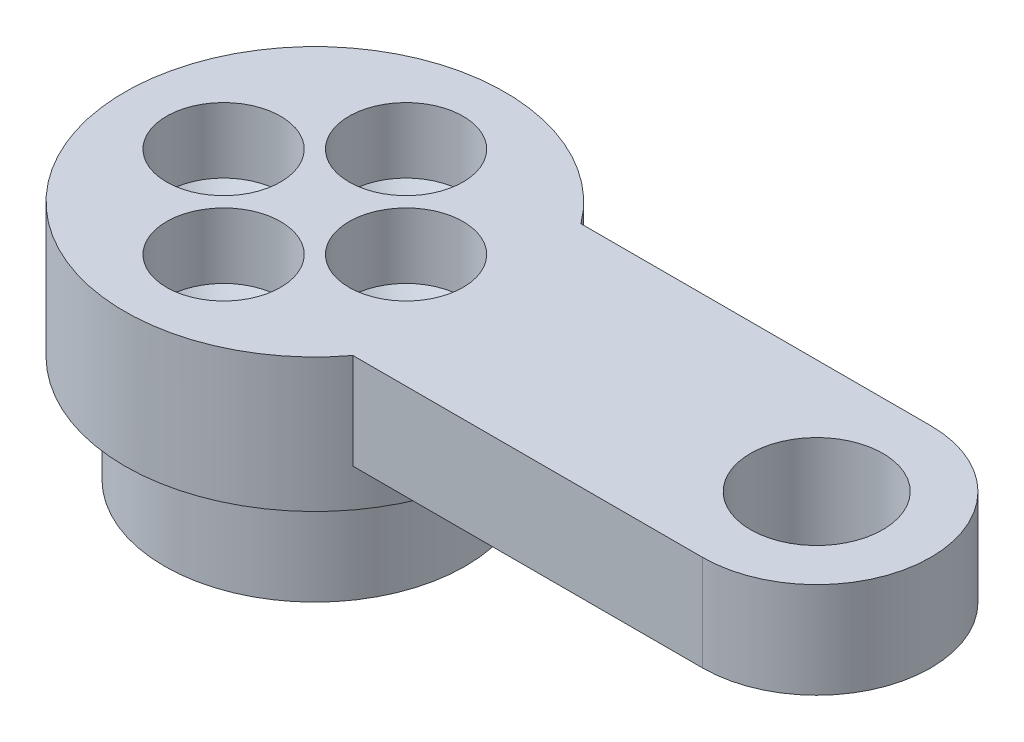
ISO-10303-21;
HEADER;
FILE_DESCRIPTION(('STEP AP214'),'2;1');
FILE_NAME('part.step','',(''),(''),'','','');
FILE_SCHEMA(('AUTOMOTIVE_DESIGN { 1 0 10303 214 1 1 1 1 }'));
ENDSEC;
DATA;
#1=APPLICATION_CONTEXT('core data for automotive mechanical design processes');
#2=APPLICATION_PROTOCOL_DEFINITION('international standard','automotive_design',2000,#1);
#3=PRODUCT_CONTEXT('',#1,'mechanical');
#4=PRODUCT('Part','Part','',(#3));
#5=PRODUCT_RELATED_PRODUCT_CATEGORY('part','',(#4));
#6=PRODUCT_DEFINITION_FORMATION('','',#4);
#7=PRODUCT_DEFINITION_CONTEXT('part definition',#1,'design');
#8=PRODUCT_DEFINITION('design','',#6,#7);
#9=PRODUCT_DEFINITION_SHAPE('','',#8);
#10=(LENGTH_UNIT() NAMED_UNIT(*) SI_UNIT(.MILLI.,.METRE.));
#11=(NAMED_UNIT(*) PLANE_ANGLE_UNIT() SI_UNIT($,.RADIAN.));
#12=(NAMED_UNIT(*) SI_UNIT($,.STERADIAN.) SOLID_ANGLE_UNIT());
#13=UNCERTAINTY_MEASURE_WITH_UNIT(LENGTH_MEASURE(1.E-05),#10,'distance_accuracy_value','');
#14=(GEOMETRIC_REPRESENTATION_CONTEXT(3) GLOBAL_UNCERTAINTY_ASSIGNED_CONTEXT((#13)) GLOBAL_UNIT_ASSIGNED_CONTEXT((#10,
#11,#12)) REPRESENTATION_CONTEXT('',''));
#15=CARTESIAN_POINT('',(0.,0.,0.));
#16=DIRECTION('',(0.,0.,1.));
#17=DIRECTION('',(1.,0.,0.));
#18=AXIS2_PLACEMENT_3D('',#15,#16,#17);
#19=CARTESIAN_POINT('',(0.,0.,0.));
#20=DIRECTION('',(0.,1.,0.));
#21=DIRECTION('',(0.,0.,1.));
#22=AXIS2_PLACEMENT_3D('',#19,#20,#21);
#23=PLANE('',#22);
#24=CARTESIAN_POINT('',(0.,0.,0.));
#25=DIRECTION('',(0.,1.,0.));
#26=DIRECTION('',(0.,0.,1.));
#27=AXIS2_PLACEMENT_3D('',#24,#25,#26);
#28=CIRCLE('',#27,9.9);
#29=CARTESIAN_POINT('',(0.,0.,9.9));
#30=VERTEX_POINT('',#29);
#31=EDGE_CURVE('E149',#30,#30,#28,.T.);
#32=ORIENTED_EDGE('',*,*,#31,.F.);
#33=EDGE_LOOP('',(#32));
#34=FACE_BOUND('',#33,.T.);
#35=CARTESIAN_POINT('',(6.,0.,0.));
#36=DIRECTION('',(0.,1.,0.));
#37=DIRECTION('',(0.,0.,1.));
#38=AXIS2_PLACEMENT_3D('',#35,#36,#37);
#39=CIRCLE('',#38,1.85);
#40=CARTESIAN_POINT('',(6.,0.,1.85));
#41=VERTEX_POINT('',#40);
#42=EDGE_CURVE('E146',#41,#41,#39,.T.);
#43=ORIENTED_EDGE('',*,*,#42,.T.);
#44=EDGE_LOOP('',(#43));
#45=FACE_BOUND('',#44,.T.);
#46=CARTESIAN_POINT('',(0.,0.,6.));
#47=DIRECTION('',(0.,1.,0.));
#48=DIRECTION('',(0.,0.,1.));
#49=AXIS2_PLACEMENT_3D('',#46,#47,#48);
#50=CIRCLE('',#49,1.85);
#51=CARTESIAN_POINT('',(0.,0.,7.85));
#52=VERTEX_POINT('',#51);
#53=EDGE_CURVE('E143',#52,#52,#50,.T.);
#54=ORIENTED_EDGE('',*,*,#53,.T.);
#55=EDGE_LOOP('',(#54));
#56=FACE_BOUND('',#55,.T.);
#57=CARTESIAN_POINT('',(-6.,0.,0.));
#58=DIRECTION('',(0.,1.,0.));
#59=DIRECTION('',(0.,0.,1.));
#60=AXIS2_PLACEMENT_3D('',#57,#58,#59);
#61=CIRCLE('',#60,1.85);
#62=CARTESIAN_POINT('',(-6.,0.,1.85));
#63=VERTEX_POINT('',#62);
#64=EDGE_CURVE('E140',#63,#63,#61,.T.);
#65=ORIENTED_EDGE('',*,*,#64,.T.);
#66=EDGE_LOOP('',(#65));
#67=FACE_BOUND('',#66,.T.);
#68=CARTESIAN_POINT('',(0.,0.,-6.));
#69=DIRECTION('',(0.,1.,0.));
#70=DIRECTION('',(0.,0.,1.));
#71=AXIS2_PLACEMENT_3D('',#68,#69,#70);
#72=CIRCLE('',#71,1.85);
#73=CARTESIAN_POINT('',(0.,0.,-4.15));
#74=VERTEX_POINT('',#73);
#75=EDGE_CURVE('E135',#74,#74,#72,.T.);
#76=ORIENTED_EDGE('',*,*,#75,.T.);
#77=EDGE_LOOP('',(#76));
#78=FACE_BOUND('',#77,.T.);
#79=ADVANCED_FACE('F36',(#34,#45,#56,#67,#78),#23,.F.);
#80=CARTESIAN_POINT('',(0.,7.,0.));
#81=DIRECTION('',(0.,-1.,0.));
#82=DIRECTION('',(0.,0.,-1.));
#83=AXIS2_PLACEMENT_3D('',#80,#81,#82);
#84=CYLINDRICAL_SURFACE('',#83,9.9);
#85=CARTESIAN_POINT('',(0.,7.,0.));
#86=DIRECTION('',(0.,1.,0.));
#87=DIRECTION('',(0.,0.,1.));
#88=AXIS2_PLACEMENT_3D('',#85,#86,#87);
#89=CIRCLE('',#88,9.9);
#90=CARTESIAN_POINT('',(0.,7.,9.9));
#91=VERTEX_POINT('',#90);
#92=EDGE_CURVE('E150',#91,#91,#89,.T.);
#93=ORIENTED_EDGE('',*,*,#92,.F.);
#94=EDGE_LOOP('',(#93));
#95=FACE_BOUND('',#94,.T.);
#96=ORIENTED_EDGE('',*,*,#31,.T.);
#97=EDGE_LOOP('',(#96));
#98=FACE_BOUND('',#97,.T.);
#99=ADVANCED_FACE('F192',(#95,#98),#84,.T.);
#100=CARTESIAN_POINT('',(6.,7.,0.));
#101=DIRECTION('',(0.,-1.,0.));
#102=DIRECTION('',(0.,0.,-1.));
#103=AXIS2_PLACEMENT_3D('',#100,#101,#102);
#104=CYLINDRICAL_SURFACE('',#103,1.85);
#105=CARTESIAN_POINT('',(6.,9.60000000000003,0.));
#106=DIRECTION('',(0.,1.,0.));
#107=DIRECTION('',(0.,0.,1.));
#108=AXIS2_PLACEMENT_3D('',#105,#106,#107);
#109=CIRCLE('',#108,1.85);
#110=CARTESIAN_POINT('',(6.,9.60000000000003,1.85));
#111=VERTEX_POINT('',#110);
#112=EDGE_CURVE('E11',#111,#111,#109,.T.);
#113=ORIENTED_EDGE('',*,*,#112,.T.);
#114=EDGE_LOOP('',(#113));
#115=FACE_BOUND('',#114,.T.);
#116=ORIENTED_EDGE('',*,*,#42,.F.);
#117=EDGE_LOOP('',(#116));
#118=FACE_BOUND('',#117,.T.);
#119=ADVANCED_FACE('F198',(#115,#118),#104,.F.);
#120=CARTESIAN_POINT('',(0.,7.,6.));
#121=DIRECTION('',(0.,-1.,0.));
#122=DIRECTION('',(0.,0.,-1.));
#123=AXIS2_PLACEMENT_3D('',#120,#121,#122);
#124=CYLINDRICAL_SURFACE('',#123,1.85);
#125=CARTESIAN_POINT('',(0.,9.60000000000003,5.99999999999999));
#126=DIRECTION('',(0.,1.,0.));
#127=DIRECTION('',(0.,0.,1.));
#128=AXIS2_PLACEMENT_3D('',#125,#126,#127);
#129=CIRCLE('',#128,1.85);
#130=CARTESIAN_POINT('',(0.,9.60000000000003,7.84999999999999));
#131=VERTEX_POINT('',#130);
#132=EDGE_CURVE('E167',#131,#131,#129,.T.);
#133=ORIENTED_EDGE('',*,*,#132,.T.);
#134=EDGE_LOOP('',(#133));
#135=FACE_BOUND('',#134,.T.);
#136=ORIENTED_EDGE('',*,*,#53,.F.);
#137=EDGE_LOOP('',(#136));
#138=FACE_BOUND('',#137,.T.);
#139=ADVANCED_FACE('F218',(#135,#138),#124,.F.);
#140=CARTESIAN_POINT('',(-6.,7.,0.));
#141=DIRECTION('',(0.,-1.,0.));
#142=DIRECTION('',(0.,0.,-1.));
#143=AXIS2_PLACEMENT_3D('',#140,#141,#142);
#144=CYLINDRICAL_SURFACE('',#143,1.85);
#145=CARTESIAN_POINT('',(-6.,9.60000000000003,0.));
#146=DIRECTION('',(0.,1.,0.));
#147=DIRECTION('',(0.,0.,1.));
#148=AXIS2_PLACEMENT_3D('',#145,#146,#147);
#149=CIRCLE('',#148,1.85);
#150=CARTESIAN_POINT('',(-6.,9.60000000000003,1.84999999999996));
#151=VERTEX_POINT('',#150);
#152=EDGE_CURVE('E170',#151,#151,#149,.T.);
#153=ORIENTED_EDGE('',*,*,#152,.T.);
#154=EDGE_LOOP('',(#153));
#155=FACE_BOUND('',#154,.T.);
#156=ORIENTED_EDGE('',*,*,#64,.F.);
#157=EDGE_LOOP('',(#156));
#158=FACE_BOUND('',#157,.T.);
#159=ADVANCED_FACE('F221',(#155,#158),#144,.F.);
#160=CARTESIAN_POINT('',(0.,7.,-6.));
#161=DIRECTION('',(0.,-1.,0.));
#162=DIRECTION('',(0.,0.,-1.));
#163=AXIS2_PLACEMENT_3D('',#160,#161,#162);
#164=CYLINDRICAL_SURFACE('',#163,1.85);
#165=CARTESIAN_POINT('',(0.,9.59999999999997,-6.));
#166=DIRECTION('',(0.,1.,0.));
#167=DIRECTION('',(0.,0.,1.));
#168=AXIS2_PLACEMENT_3D('',#165,#166,#167);
#169=CIRCLE('',#168,1.85);
#170=CARTESIAN_POINT('',(0.,9.59999999999997,-4.15));
#171=VERTEX_POINT('',#170);
#172=EDGE_CURVE('E44',#171,#171,#169,.T.);
#173=ORIENTED_EDGE('',*,*,#172,.T.);
#174=EDGE_LOOP('',(#173));
#175=FACE_BOUND('',#174,.T.);
#176=ORIENTED_EDGE('',*,*,#75,.F.);
#177=EDGE_LOOP('',(#176));
#178=FACE_BOUND('',#177,.T.);
#179=ADVANCED_FACE('F175',(#175,#178),#164,.F.);
#180=CARTESIAN_POINT('',(0.,7.,0.));
#181=DIRECTION('',(0.,1.,0.));
#182=DIRECTION('',(0.,0.,1.));
#183=AXIS2_PLACEMENT_3D('',#180,#181,#182);
#184=PLANE('',#183);
#185=ORIENTED_EDGE('',*,*,#92,.T.);
#186=EDGE_LOOP('',(#185));
#187=FACE_BOUND('',#186,.T.);
#188=CARTESIAN_POINT('',(0.,7.,0.));
#189=DIRECTION('',(0.,1.,0.));
#190=DIRECTION('',(0.,0.,1.));
#191=AXIS2_PLACEMENT_3D('',#188,#189,#190);
#192=CIRCLE('',#191,12.5);
#193=CARTESIAN_POINT('',(0.,7.,12.5));
#194=VERTEX_POINT('',#193);
#195=EDGE_CURVE('E133',#194,#194,#192,.T.);
#196=ORIENTED_EDGE('',*,*,#195,.F.);
#197=EDGE_LOOP('',(#196));
#198=FACE_BOUND('',#197,.T.);
#199=ADVANCED_FACE('F229',(#187,#198),#184,.F.);
#200=CARTESIAN_POINT('',(0.,9.5,0.));
#201=DIRECTION('',(0.,-1.,0.));
#202=DIRECTION('',(0.,0.,-1.));
#203=AXIS2_PLACEMENT_3D('',#200,#201,#202);
#204=CYLINDRICAL_SURFACE('',#203,12.5);
#205=CARTESIAN_POINT('',(0.,9.5,0.));
#206=DIRECTION('',(0.,1.,0.));
#207=DIRECTION('',(0.,0.,1.));
#208=AXIS2_PLACEMENT_3D('',#205,#206,#207);
#209=CIRCLE('',#208,12.5);
#210=CARTESIAN_POINT('',(10.,9.5,7.5));
#211=VERTEX_POINT('',#210);
#212=CARTESIAN_POINT('',(10.,9.5,-7.5));
#213=VERTEX_POINT('',#212);
#214=EDGE_CURVE('E51',#211,#213,#209,.T.);
#215=ORIENTED_EDGE('',*,*,#214,.F.);
#216=DIRECTION('',(0.,-1.,0.));
#217=VECTOR('',#216,1.);
#218=CARTESIAN_POINT('',(10.,15.8,7.5));
#219=LINE('',#218,#217);
#220=CARTESIAN_POINT('',(10.,15.8,7.5));
#221=VERTEX_POINT('',#220);
#222=EDGE_CURVE('E99',#221,#211,#219,.T.);
#223=ORIENTED_EDGE('',*,*,#222,.F.);
#224=CARTESIAN_POINT('',(0.,15.8,0.));
#225=DIRECTION('',(0.,1.,0.));
#226=DIRECTION('',(0.,0.,1.));
#227=AXIS2_PLACEMENT_3D('',#224,#225,#226);
#228=CIRCLE('',#227,12.5);
#229=CARTESIAN_POINT('',(10.,15.8,-7.5));
#230=VERTEX_POINT('',#229);
#231=EDGE_CURVE('E88',#230,#221,#228,.T.);
#232=ORIENTED_EDGE('',*,*,#231,.F.);
#233=DIRECTION('',(0.,-1.,0.));
#234=VECTOR('',#233,1.);
#235=CARTESIAN_POINT('',(10.,15.8,-7.5));
#236=LINE('',#235,#234);
#237=EDGE_CURVE('E94',#230,#213,#236,.T.);
#238=ORIENTED_EDGE('',*,*,#237,.T.);
#239=EDGE_LOOP('',(#215,#223,#232,#238));
#240=FACE_BOUND('',#239,.T.);
#241=ORIENTED_EDGE('',*,*,#195,.T.);
#242=EDGE_LOOP('',(#241));
#243=FACE_BOUND('',#242,.T.);
#244=ADVANCED_FACE('F101',(#240,#243),#204,.T.);
#245=CARTESIAN_POINT('',(0.,9.5,0.));
#246=DIRECTION('',(0.,1.,0.));
#247=DIRECTION('',(0.,0.,1.));
#248=AXIS2_PLACEMENT_3D('',#245,#246,#247);
#249=PLANE('',#248);
#250=CARTESIAN_POINT('',(33.,9.5,0.));
#251=DIRECTION('',(0.,1.,0.));
#252=DIRECTION('',(0.,0.,1.));
#253=AXIS2_PLACEMENT_3D('',#250,#251,#252);
#254=CIRCLE('',#253,4.35);
#255=CARTESIAN_POINT('',(33.,9.5,4.35));
#256=VERTEX_POINT('',#255);
#257=EDGE_CURVE('E121',#256,#256,#254,.T.);
#258=ORIENTED_EDGE('',*,*,#257,.T.);
#259=EDGE_LOOP('',(#258));
#260=FACE_BOUND('',#259,.T.);
#261=DIRECTION('',(-1.,0.,0.));
#262=VECTOR('',#261,1.);
#263=CARTESIAN_POINT('',(0.,9.5,7.50000000000001));
#264=LINE('',#263,#262);
#265=CARTESIAN_POINT('',(33.,9.5,7.5));
#266=VERTEX_POINT('',#265);
#267=EDGE_CURVE('E127',#266,#211,#264,.T.);
#268=ORIENTED_EDGE('',*,*,#267,.T.);
#269=ORIENTED_EDGE('',*,*,#214,.T.);
#270=DIRECTION('',(-1.,0.,0.));
#271=VECTOR('',#270,1.);
#272=CARTESIAN_POINT('',(0.,9.5,-7.50000000000001));
#273=LINE('',#272,#271);
#274=CARTESIAN_POINT('',(33.,9.5,-7.5));
#275=VERTEX_POINT('',#274);
#276=EDGE_CURVE('E96',#275,#213,#273,.T.);
#277=ORIENTED_EDGE('',*,*,#276,.F.);
#278=CARTESIAN_POINT('',(33.,9.5,0.));
#279=DIRECTION('',(0.,1.,0.));
#280=DIRECTION('',(0.,0.,1.));
#281=AXIS2_PLACEMENT_3D('',#278,#279,#280);
#282=CIRCLE('',#281,7.5);
#283=EDGE_CURVE('E124',#266,#275,#282,.T.);
#284=ORIENTED_EDGE('',*,*,#283,.F.);
#285=EDGE_LOOP('',(#268,#269,#277,#284));
#286=FACE_BOUND('',#285,.T.);
#287=ADVANCED_FACE('F241',(#260,#286),#249,.F.);
#288=CARTESIAN_POINT('',(33.,15.8,0.));
#289=DIRECTION('',(0.,-1.,0.));
#290=DIRECTION('',(0.,0.,-1.));
#291=AXIS2_PLACEMENT_3D('',#288,#289,#290);
#292=CYLINDRICAL_SURFACE('',#291,7.5);
#293=ORIENTED_EDGE('',*,*,#283,.T.);
#294=DIRECTION('',(0.,-1.,0.));
#295=VECTOR('',#294,1.);
#296=CARTESIAN_POINT('',(33.,15.8,-7.5));
#297=LINE('',#296,#295);
#298=CARTESIAN_POINT('',(33.,15.8,-7.5));
#299=VERTEX_POINT('',#298);
#300=EDGE_CURVE('E98',#299,#275,#297,.T.);
#301=ORIENTED_EDGE('',*,*,#300,.F.);
#302=CARTESIAN_POINT('',(33.,15.8,0.));
#303=DIRECTION('',(0.,1.,0.));
#304=DIRECTION('',(0.,0.,1.));
#305=AXIS2_PLACEMENT_3D('',#302,#303,#304);
#306=CIRCLE('',#305,7.5);
#307=CARTESIAN_POINT('',(33.,15.8,7.5));
#308=VERTEX_POINT('',#307);
#309=EDGE_CURVE('E90',#308,#299,#306,.T.);
#310=ORIENTED_EDGE('',*,*,#309,.F.);
#311=DIRECTION('',(0.,-1.,0.));
#312=VECTOR('',#311,1.);
#313=CARTESIAN_POINT('',(33.,15.8,7.5));
#314=LINE('',#313,#312);
#315=EDGE_CURVE('E60',#308,#266,#314,.T.);
#316=ORIENTED_EDGE('',*,*,#315,.T.);
#317=EDGE_LOOP('',(#293,#301,#310,#316));
#318=FACE_BOUND('',#317,.T.);
#319=ADVANCED_FACE('F248',(#318),#292,.T.);
#320=CARTESIAN_POINT('',(0.,15.8,-7.50000000000001));
#321=DIRECTION('',(0.,0.,1.));
#322=DIRECTION('',(1.,0.,0.));
#323=AXIS2_PLACEMENT_3D('',#320,#321,#322);
#324=PLANE('',#323);
#325=ORIENTED_EDGE('',*,*,#276,.T.);
#326=ORIENTED_EDGE('',*,*,#237,.F.);
#327=DIRECTION('',(-1.,0.,0.));
#328=VECTOR('',#327,1.);
#329=CARTESIAN_POINT('',(0.,15.8,-7.50000000000001));
#330=LINE('',#329,#328);
#331=EDGE_CURVE('E81',#299,#230,#330,.T.);
#332=ORIENTED_EDGE('',*,*,#331,.F.);
#333=ORIENTED_EDGE('',*,*,#300,.T.);
#334=EDGE_LOOP('',(#325,#326,#332,#333));
#335=FACE_BOUND('',#334,.T.);
#336=ADVANCED_FACE('F95',(#335),#324,.F.);
#337=CARTESIAN_POINT('',(0.,15.8,5.99999999999999));
#338=DIRECTION('',(0.,-1.,0.));
#339=DIRECTION('',(0.,0.,-1.));
#340=AXIS2_PLACEMENT_3D('',#337,#338,#339);
#341=CYLINDRICAL_SURFACE('',#340,3.75);
#342=CARTESIAN_POINT('',(0.,11.5,5.99999999999999));
#343=DIRECTION('',(0.,1.,0.));
#344=DIRECTION('',(0.,0.,1.));
#345=AXIS2_PLACEMENT_3D('',#342,#343,#344);
#346=CIRCLE('',#345,3.75);
#347=CARTESIAN_POINT('',(0.,11.5,9.74999999999999));
#348=VERTEX_POINT('',#347);
#349=EDGE_CURVE('E153',#348,#348,#346,.F.);
#350=ORIENTED_EDGE('',*,*,#349,.T.);
#351=EDGE_LOOP('',(#350));
#352=FACE_BOUND('',#351,.T.);
#353=CARTESIAN_POINT('',(0.,15.8,5.99999999999999));
#354=DIRECTION('',(0.,1.,0.));
#355=DIRECTION('',(0.,0.,1.));
#356=AXIS2_PLACEMENT_3D('',#353,#354,#355);
#357=CIRCLE('',#356,3.75);
#358=CARTESIAN_POINT('',(0.,15.8,9.74999999999999));
#359=VERTEX_POINT('',#358);
#360=EDGE_CURVE('E115',#359,#359,#357,.T.);
#361=ORIENTED_EDGE('',*,*,#360,.T.);
#362=EDGE_LOOP('',(#361));
#363=FACE_BOUND('',#362,.T.);
#364=ADVANCED_FACE('F253',(#352,#363),#341,.F.);
#365=CARTESIAN_POINT('',(6.,15.8,0.));
#366=DIRECTION('',(0.,-1.,0.));
#367=DIRECTION('',(0.,0.,-1.));
#368=AXIS2_PLACEMENT_3D('',#365,#366,#367);
#369=CYLINDRICAL_SURFACE('',#368,3.75);
#370=CARTESIAN_POINT('',(6.,11.5,0.));
#371=DIRECTION('',(0.,1.,0.));
#372=DIRECTION('',(0.,0.,1.));
#373=AXIS2_PLACEMENT_3D('',#370,#371,#372);
#374=CIRCLE('',#373,3.75);
#375=CARTESIAN_POINT('',(6.,11.5,3.75));
#376=VERTEX_POINT('',#375);
#377=EDGE_CURVE('E164',#376,#376,#374,.F.);
#378=ORIENTED_EDGE('',*,*,#377,.T.);
#379=EDGE_LOOP('',(#378));
#380=FACE_BOUND('',#379,.T.);
#381=CARTESIAN_POINT('',(6.,15.8,0.));
#382=DIRECTION('',(0.,1.,0.));
#383=DIRECTION('',(0.,0.,1.));
#384=AXIS2_PLACEMENT_3D('',#381,#382,#383);
#385=CIRCLE('',#384,3.75);
#386=CARTESIAN_POINT('',(6.,15.8,3.75));
#387=VERTEX_POINT('',#386);
#388=EDGE_CURVE('E112',#387,#387,#385,.T.);
#389=ORIENTED_EDGE('',*,*,#388,.T.);
#390=EDGE_LOOP('',(#389));
#391=FACE_BOUND('',#390,.T.);
#392=ADVANCED_FACE('F259',(#380,#391),#369,.F.);
#393=CARTESIAN_POINT('',(-6.,15.8,0.));
#394=DIRECTION('',(0.,-1.,0.));
#395=DIRECTION('',(0.,0.,-1.));
#396=AXIS2_PLACEMENT_3D('',#393,#394,#395);
#397=CYLINDRICAL_SURFACE('',#396,3.75);
#398=CARTESIAN_POINT('',(-6.,11.5,0.));
#399=DIRECTION('',(0.,1.,0.));
#400=DIRECTION('',(0.,0.,1.));
#401=AXIS2_PLACEMENT_3D('',#398,#399,#400);
#402=CIRCLE('',#401,3.75);
#403=CARTESIAN_POINT('',(-6.,11.5,3.74999999999996));
#404=VERTEX_POINT('',#403);
#405=EDGE_CURVE('E158',#404,#404,#402,.F.);
#406=ORIENTED_EDGE('',*,*,#405,.T.);
#407=EDGE_LOOP('',(#406));
#408=FACE_BOUND('',#407,.T.);
#409=CARTESIAN_POINT('',(-6.,15.8,0.));
#410=DIRECTION('',(0.,1.,0.));
#411=DIRECTION('',(0.,0.,1.));
#412=AXIS2_PLACEMENT_3D('',#409,#410,#411);
#413=CIRCLE('',#412,3.75);
#414=CARTESIAN_POINT('',(-6.,15.8,3.74999999999996));
#415=VERTEX_POINT('',#414);
#416=EDGE_CURVE('E106',#415,#415,#413,.T.);
#417=ORIENTED_EDGE('',*,*,#416,.T.);
#418=EDGE_LOOP('',(#417));
#419=FACE_BOUND('',#418,.T.);
#420=ADVANCED_FACE('F256',(#408,#419),#397,.F.);
#421=CARTESIAN_POINT('',(0.,15.8,7.50000000000001));
#422=DIRECTION('',(0.,0.,1.));
#423=DIRECTION('',(1.,0.,0.));
#424=AXIS2_PLACEMENT_3D('',#421,#422,#423);
#425=PLANE('',#424);
#426=ORIENTED_EDGE('',*,*,#267,.F.);
#427=ORIENTED_EDGE('',*,*,#315,.F.);
#428=DIRECTION('',(-1.,0.,0.));
#429=VECTOR('',#428,1.);
#430=CARTESIAN_POINT('',(0.,15.8,7.50000000000001));
#431=LINE('',#430,#429);
#432=EDGE_CURVE('E104',#308,#221,#431,.T.);
#433=ORIENTED_EDGE('',*,*,#432,.T.);
#434=ORIENTED_EDGE('',*,*,#222,.T.);
#435=EDGE_LOOP('',(#426,#427,#433,#434));
#436=FACE_BOUND('',#435,.T.);
#437=ADVANCED_FACE('F246',(#436),#425,.T.);
#438=CARTESIAN_POINT('',(33.,15.8,0.));
#439=DIRECTION('',(0.,-1.,0.));
#440=DIRECTION('',(0.,0.,-1.));
#441=AXIS2_PLACEMENT_3D('',#438,#439,#440);
#442=CYLINDRICAL_SURFACE('',#441,4.35);
#443=CARTESIAN_POINT('',(33.,15.8,0.));
#444=DIRECTION('',(0.,1.,0.));
#445=DIRECTION('',(0.,0.,1.));
#446=AXIS2_PLACEMENT_3D('',#443,#444,#445);
#447=CIRCLE('',#446,4.35);
#448=CARTESIAN_POINT('',(33.,15.8,4.35));
#449=VERTEX_POINT('',#448);
#450=EDGE_CURVE('E129',#449,#449,#447,.T.);
#451=ORIENTED_EDGE('',*,*,#450,.T.);
#452=EDGE_LOOP('',(#451));
#453=FACE_BOUND('',#452,.T.);
#454=ORIENTED_EDGE('',*,*,#257,.F.);
#455=EDGE_LOOP('',(#454));
#456=FACE_BOUND('',#455,.T.);
#457=ADVANCED_FACE('F243',(#453,#456),#442,.F.);
#458=CARTESIAN_POINT('',(0.,15.8,-6.));
#459=DIRECTION('',(0.,-1.,0.));
#460=DIRECTION('',(0.,0.,-1.));
#461=AXIS2_PLACEMENT_3D('',#458,#459,#460);
#462=CYLINDRICAL_SURFACE('',#461,3.75000000000006);
#463=CARTESIAN_POINT('',(0.,11.5,-6.));
#464=DIRECTION('',(0.,1.,0.));
#465=DIRECTION('',(0.,0.,1.));
#466=AXIS2_PLACEMENT_3D('',#463,#464,#465);
#467=CIRCLE('',#466,3.75000000000006);
#468=CARTESIAN_POINT('',(0.,11.5,-2.24999999999994));
#469=VERTEX_POINT('',#468);
#470=EDGE_CURVE('E161',#469,#469,#467,.F.);
#471=ORIENTED_EDGE('',*,*,#470,.T.);
#472=EDGE_LOOP('',(#471));
#473=FACE_BOUND('',#472,.T.);
#474=CARTESIAN_POINT('',(0.,15.8,-6.));
#475=DIRECTION('',(0.,1.,0.));
#476=DIRECTION('',(0.,0.,1.));
#477=AXIS2_PLACEMENT_3D('',#474,#475,#476);
#478=CIRCLE('',#477,3.75000000000006);
#479=CARTESIAN_POINT('',(0.,15.8,-2.24999999999994));
#480=VERTEX_POINT('',#479);
#481=EDGE_CURVE('E118',#480,#480,#478,.T.);
#482=ORIENTED_EDGE('',*,*,#481,.T.);
#483=EDGE_LOOP('',(#482));
#484=FACE_BOUND('',#483,.T.);
#485=ADVANCED_FACE('F211',(#473,#484),#462,.F.);
#486=CARTESIAN_POINT('',(0.,15.8,0.));
#487=DIRECTION('',(0.,1.,0.));
#488=DIRECTION('',(0.,0.,1.));
#489=AXIS2_PLACEMENT_3D('',#486,#487,#488);
#490=PLANE('',#489);
#491=ORIENTED_EDGE('',*,*,#450,.F.);
#492=EDGE_LOOP('',(#491));
#493=FACE_BOUND('',#492,.T.);
#494=ORIENTED_EDGE('',*,*,#309,.T.);
#495=ORIENTED_EDGE('',*,*,#331,.T.);
#496=ORIENTED_EDGE('',*,*,#231,.T.);
#497=ORIENTED_EDGE('',*,*,#432,.F.);
#498=EDGE_LOOP('',(#494,#495,#496,#497));
#499=FACE_BOUND('',#498,.T.);
#500=ORIENTED_EDGE('',*,*,#416,.F.);
#501=EDGE_LOOP('',(#500));
#502=FACE_BOUND('',#501,.T.);
#503=ORIENTED_EDGE('',*,*,#388,.F.);
#504=EDGE_LOOP('',(#503));
#505=FACE_BOUND('',#504,.T.);
#506=ORIENTED_EDGE('',*,*,#360,.F.);
#507=EDGE_LOOP('',(#506));
#508=FACE_BOUND('',#507,.T.);
#509=ORIENTED_EDGE('',*,*,#481,.F.);
#510=EDGE_LOOP('',(#509));
#511=FACE_BOUND('',#510,.T.);
#512=ADVANCED_FACE('F84',(#493,#499,#502,#505,#508,#511),#490,.T.);
#513=CARTESIAN_POINT('',(0.,9.5,5.99999999999999));
#514=DIRECTION('',(0.,1.,0.));
#515=DIRECTION('',(0.,0.,1.));
#516=AXIS2_PLACEMENT_3D('',#513,#514,#515);
#517=CONICAL_SURFACE('',#516,1.74999999999997,0.785398163397453);
#518=ORIENTED_EDGE('',*,*,#349,.F.);
#519=EDGE_LOOP('',(#518));
#520=FACE_BOUND('',#519,.T.);
#521=ORIENTED_EDGE('',*,*,#132,.F.);
#522=EDGE_LOOP('',(#521));
#523=FACE_BOUND('',#522,.T.);
#524=ADVANCED_FACE('F187',(#520,#523),#517,.F.);
#525=CARTESIAN_POINT('',(-6.,9.5,0.));
#526=DIRECTION('',(0.,1.,0.));
#527=DIRECTION('',(0.,0.,1.));
#528=AXIS2_PLACEMENT_3D('',#525,#526,#527);
#529=CONICAL_SURFACE('',#528,1.74999999999996,0.785398163397454);
#530=ORIENTED_EDGE('',*,*,#405,.F.);
#531=EDGE_LOOP('',(#530));
#532=FACE_BOUND('',#531,.T.);
#533=ORIENTED_EDGE('',*,*,#152,.F.);
#534=EDGE_LOOP('',(#533));
#535=FACE_BOUND('',#534,.T.);
#536=ADVANCED_FACE('F180',(#532,#535),#529,.F.);
#537=CARTESIAN_POINT('',(0.,9.5,-6.));
#538=DIRECTION('',(0.,1.,0.));
#539=DIRECTION('',(0.,0.,1.));
#540=AXIS2_PLACEMENT_3D('',#537,#538,#539);
#541=CONICAL_SURFACE('',#540,1.75000000000003,0.785398163397453);
#542=ORIENTED_EDGE('',*,*,#470,.F.);
#543=EDGE_LOOP('',(#542));
#544=FACE_BOUND('',#543,.T.);
#545=ORIENTED_EDGE('',*,*,#172,.F.);
#546=EDGE_LOOP('',(#545));
#547=FACE_BOUND('',#546,.T.);
#548=ADVANCED_FACE('F178',(#544,#547),#541,.F.);
#549=CARTESIAN_POINT('',(6.,9.5,0.));
#550=DIRECTION('',(0.,1.,0.));
#551=DIRECTION('',(0.,0.,1.));
#552=AXIS2_PLACEMENT_3D('',#549,#550,#551);
#553=CONICAL_SURFACE('',#552,1.74999999999996,0.785398163397454);
#554=ORIENTED_EDGE('',*,*,#377,.F.);
#555=EDGE_LOOP('',(#554));
#556=FACE_BOUND('',#555,.T.);
#557=ORIENTED_EDGE('',*,*,#112,.F.);
#558=EDGE_LOOP('',(#557));
#559=FACE_BOUND('',#558,.T.);
#560=ADVANCED_FACE('F38',(#556,#559),#553,.F.);
#561=CLOSED_SHELL('',(#79,#99,#119,#139,#159,#179,#199,#244,#287,#319,#336,#364,#392,#420,#437,
#457,#485,#512,#524,#536,#548,#560));
#562=MANIFOLD_SOLID_BREP('B2',#561);
#563=ADVANCED_BREP_SHAPE_REPRESENTATION('',(#18,#562),#14);
#564=SHAPE_DEFINITION_REPRESENTATION(#9,#563);
ENDSEC;
END-ISO-10303-21;
